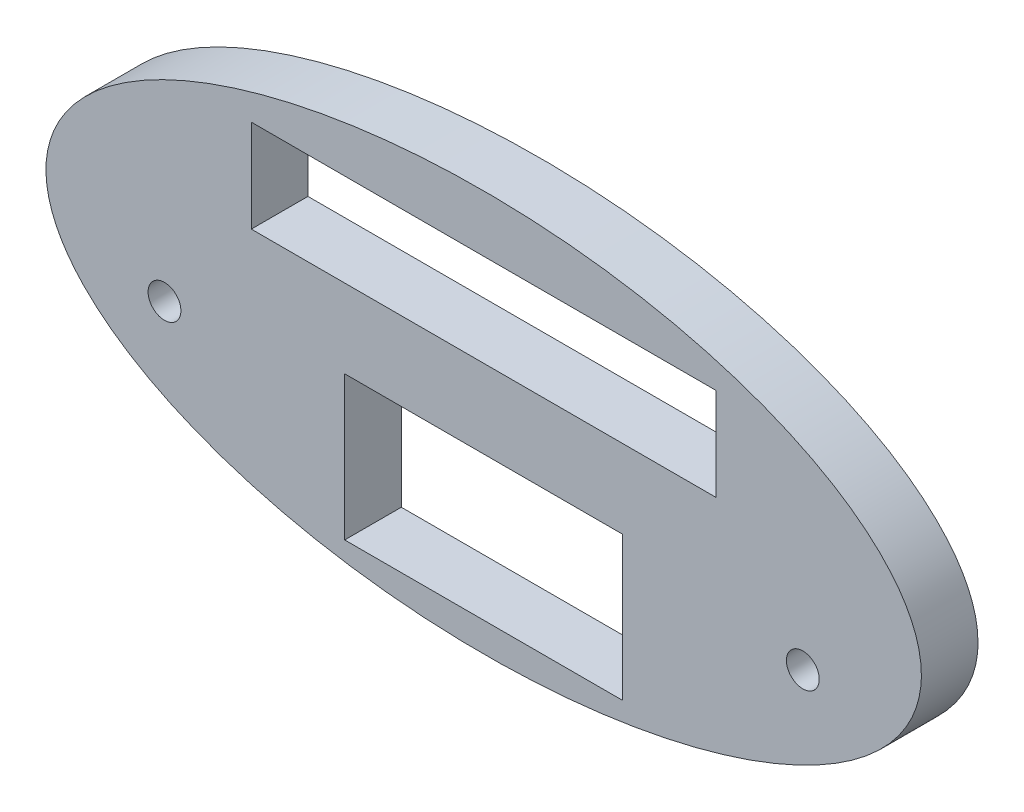
ISO-10303-21;
HEADER;
FILE_DESCRIPTION(('STEP AP214'),'2;1');
FILE_NAME('part.step','',(''),(''),'','','');
FILE_SCHEMA(('AUTOMOTIVE_DESIGN { 1 0 10303 214 1 1 1 1 }'));
ENDSEC;
DATA;
#1=APPLICATION_CONTEXT('core data for automotive mechanical design processes');
#2=APPLICATION_PROTOCOL_DEFINITION('international standard','automotive_design',2000,#1);
#3=PRODUCT_CONTEXT('',#1,'mechanical');
#4=PRODUCT('Part','Part','',(#3));
#5=PRODUCT_RELATED_PRODUCT_CATEGORY('part','',(#4));
#6=PRODUCT_DEFINITION_FORMATION('','',#4);
#7=PRODUCT_DEFINITION_CONTEXT('part definition',#1,'design');
#8=PRODUCT_DEFINITION('design','',#6,#7);
#9=PRODUCT_DEFINITION_SHAPE('','',#8);
#10=(LENGTH_UNIT() NAMED_UNIT(*) SI_UNIT(.MILLI.,.METRE.));
#11=(NAMED_UNIT(*) PLANE_ANGLE_UNIT() SI_UNIT($,.RADIAN.));
#12=(NAMED_UNIT(*) SI_UNIT($,.STERADIAN.) SOLID_ANGLE_UNIT());
#13=UNCERTAINTY_MEASURE_WITH_UNIT(LENGTH_MEASURE(1.E-05),#10,'distance_accuracy_value','');
#14=(GEOMETRIC_REPRESENTATION_CONTEXT(3) GLOBAL_UNCERTAINTY_ASSIGNED_CONTEXT((#13)) GLOBAL_UNIT_ASSIGNED_CONTEXT((#10,
#11,#12)) REPRESENTATION_CONTEXT('',''));
#15=CARTESIAN_POINT('',(0.,0.,0.));
#16=DIRECTION('',(0.,0.,1.));
#17=DIRECTION('',(1.,0.,0.));
#18=AXIS2_PLACEMENT_3D('',#15,#16,#17);
#19=CARTESIAN_POINT('',(0.,0.,-31.055));
#20=DIRECTION('',(0.,0.,1.));
#21=DIRECTION('',(1.,0.,0.));
#22=AXIS2_PLACEMENT_3D('',#19,#20,#21);
#23=ELLIPSE('',#22,240.,110.);
#24=DIRECTION('',(0.,0.,1.));
#25=VECTOR('',#24,1.);
#26=SURFACE_OF_LINEAR_EXTRUSION('',#23,#25);
#27=CARTESIAN_POINT('',(240.,0.,-31.055));
#28=VERTEX_POINT('',#27);
#29=EDGE_CURVE('E11',#28,#28,#23,.T.);
#30=ORIENTED_EDGE('',*,*,#29,.T.);
#31=EDGE_LOOP('',(#30));
#32=FACE_BOUND('',#31,.T.);
#33=CARTESIAN_POINT('',(0.,0.,0.));
#34=DIRECTION('',(0.,0.,1.));
#35=DIRECTION('',(1.,0.,0.));
#36=AXIS2_PLACEMENT_3D('',#33,#34,#35);
#37=ELLIPSE('',#36,240.,110.);
#38=CARTESIAN_POINT('',(240.,0.,0.));
#39=VERTEX_POINT('',#38);
#40=EDGE_CURVE('E39',#39,#39,#37,.T.);
#41=ORIENTED_EDGE('',*,*,#40,.F.);
#42=EDGE_LOOP('',(#41));
#43=FACE_BOUND('',#42,.T.);
#44=ADVANCED_FACE('F35',(#32,#43),#26,.T.);
#45=CARTESIAN_POINT('',(0.,0.,-31.055));
#46=DIRECTION('',(0.,0.,1.));
#47=DIRECTION('',(1.,0.,0.));
#48=AXIS2_PLACEMENT_3D('',#45,#46,#47);
#49=PLANE('',#48);
#50=CARTESIAN_POINT('',(175.,-30.,-31.055));
#51=DIRECTION('',(0.,0.,1.));
#52=DIRECTION('',(1.,0.,0.));
#53=AXIS2_PLACEMENT_3D('',#50,#51,#52);
#54=CIRCLE('',#53,9.00000000000001);
#55=CARTESIAN_POINT('',(184.,-30.,-31.055));
#56=VERTEX_POINT('',#55);
#57=EDGE_CURVE('E130',#56,#56,#54,.T.);
#58=ORIENTED_EDGE('',*,*,#57,.T.);
#59=EDGE_LOOP('',(#58));
#60=FACE_BOUND('',#59,.T.);
#61=CARTESIAN_POINT('',(-175.,-30.,-31.055));
#62=DIRECTION('',(0.,0.,1.));
#63=DIRECTION('',(-1.,0.,0.));
#64=AXIS2_PLACEMENT_3D('',#61,#62,#63);
#65=CIRCLE('',#64,9.00000000000001);
#66=CARTESIAN_POINT('',(-184.,-30.,-31.055));
#67=VERTEX_POINT('',#66);
#68=EDGE_CURVE('E248',#67,#67,#65,.T.);
#69=ORIENTED_EDGE('',*,*,#68,.T.);
#70=EDGE_LOOP('',(#69));
#71=FACE_BOUND('',#70,.T.);
#72=DIRECTION('',(-1.,0.,0.));
#73=VECTOR('',#72,1.);
#74=CARTESIAN_POINT('',(-76.2,-15.,-31.055));
#75=LINE('',#74,#73);
#76=CARTESIAN_POINT('',(76.2,-15.,-31.055));
#77=VERTEX_POINT('',#76);
#78=CARTESIAN_POINT('',(-76.2,-15.,-31.055));
#79=VERTEX_POINT('',#78);
#80=EDGE_CURVE('E107',#77,#79,#75,.T.);
#81=ORIENTED_EDGE('',*,*,#80,.T.);
#82=DIRECTION('',(0.,-1.,0.));
#83=VECTOR('',#82,1.);
#84=CARTESIAN_POINT('',(-76.2,-15.,-31.055));
#85=LINE('',#84,#83);
#86=CARTESIAN_POINT('',(-76.2,-93.9,-31.055));
#87=VERTEX_POINT('',#86);
#88=EDGE_CURVE('E101',#79,#87,#85,.T.);
#89=ORIENTED_EDGE('',*,*,#88,.T.);
#90=DIRECTION('',(1.,0.,0.));
#91=VECTOR('',#90,1.);
#92=CARTESIAN_POINT('',(-76.2,-93.9,-31.055));
#93=LINE('',#92,#91);
#94=CARTESIAN_POINT('',(76.2,-93.9,-31.055));
#95=VERTEX_POINT('',#94);
#96=EDGE_CURVE('E110',#87,#95,#93,.T.);
#97=ORIENTED_EDGE('',*,*,#96,.T.);
#98=DIRECTION('',(0.,1.,0.));
#99=VECTOR('',#98,1.);
#100=CARTESIAN_POINT('',(76.2,-15.,-31.055));
#101=LINE('',#100,#99);
#102=EDGE_CURVE('E49',#95,#77,#101,.T.);
#103=ORIENTED_EDGE('',*,*,#102,.T.);
#104=EDGE_LOOP('',(#81,#89,#97,#103));
#105=FACE_BOUND('',#104,.T.);
#106=DIRECTION('',(-1.,0.,0.));
#107=VECTOR('',#106,1.);
#108=CARTESIAN_POINT('',(-127.4,78.9000000000001,-31.055));
#109=LINE('',#108,#107);
#110=CARTESIAN_POINT('',(127.4,78.9,-31.055));
#111=VERTEX_POINT('',#110);
#112=CARTESIAN_POINT('',(-127.4,78.9000000000001,-31.055));
#113=VERTEX_POINT('',#112);
#114=EDGE_CURVE('E150',#111,#113,#109,.T.);
#115=ORIENTED_EDGE('',*,*,#114,.T.);
#116=DIRECTION('',(0.,-1.,0.));
#117=VECTOR('',#116,1.);
#118=CARTESIAN_POINT('',(-127.4,78.9000000000001,-31.055));
#119=LINE('',#118,#117);
#120=CARTESIAN_POINT('',(-127.4,28.1,-31.055));
#121=VERTEX_POINT('',#120);
#122=EDGE_CURVE('E140',#113,#121,#119,.T.);
#123=ORIENTED_EDGE('',*,*,#122,.T.);
#124=DIRECTION('',(1.,0.,0.));
#125=VECTOR('',#124,1.);
#126=CARTESIAN_POINT('',(-127.4,28.1,-31.055));
#127=LINE('',#126,#125);
#128=CARTESIAN_POINT('',(127.4,28.1,-31.055));
#129=VERTEX_POINT('',#128);
#130=EDGE_CURVE('E143',#121,#129,#127,.T.);
#131=ORIENTED_EDGE('',*,*,#130,.T.);
#132=DIRECTION('',(0.,1.,0.));
#133=VECTOR('',#132,1.);
#134=CARTESIAN_POINT('',(127.4,78.9,-31.055));
#135=LINE('',#134,#133);
#136=EDGE_CURVE('E147',#129,#111,#135,.T.);
#137=ORIENTED_EDGE('',*,*,#136,.T.);
#138=EDGE_LOOP('',(#115,#123,#131,#137));
#139=FACE_BOUND('',#138,.T.);
#140=ORIENTED_EDGE('',*,*,#29,.F.);
#141=EDGE_LOOP('',(#140));
#142=FACE_BOUND('',#141,.T.);
#143=ADVANCED_FACE('F114',(#60,#71,#105,#139,#142),#49,.F.);
#144=CARTESIAN_POINT('',(0.,0.,0.));
#145=DIRECTION('',(0.,0.,1.));
#146=DIRECTION('',(1.,0.,0.));
#147=AXIS2_PLACEMENT_3D('',#144,#145,#146);
#148=PLANE('',#147);
#149=CARTESIAN_POINT('',(175.,-30.,0.));
#150=DIRECTION('',(0.,0.,1.));
#151=DIRECTION('',(1.,0.,0.));
#152=AXIS2_PLACEMENT_3D('',#149,#150,#151);
#153=CIRCLE('',#152,9.00000000000001);
#154=CARTESIAN_POINT('',(184.,-30.,0.));
#155=VERTEX_POINT('',#154);
#156=EDGE_CURVE('E247',#155,#155,#153,.T.);
#157=ORIENTED_EDGE('',*,*,#156,.F.);
#158=EDGE_LOOP('',(#157));
#159=FACE_BOUND('',#158,.T.);
#160=CARTESIAN_POINT('',(-175.,-30.,0.));
#161=DIRECTION('',(0.,0.,1.));
#162=DIRECTION('',(-1.,0.,0.));
#163=AXIS2_PLACEMENT_3D('',#160,#161,#162);
#164=CIRCLE('',#163,9.00000000000001);
#165=CARTESIAN_POINT('',(-184.,-30.,0.));
#166=VERTEX_POINT('',#165);
#167=EDGE_CURVE('E123',#166,#166,#164,.T.);
#168=ORIENTED_EDGE('',*,*,#167,.F.);
#169=EDGE_LOOP('',(#168));
#170=FACE_BOUND('',#169,.T.);
#171=DIRECTION('',(0.,-1.,0.));
#172=VECTOR('',#171,1.);
#173=CARTESIAN_POINT('',(-76.2,-15.,0.));
#174=LINE('',#173,#172);
#175=CARTESIAN_POINT('',(-76.2,-15.,0.));
#176=VERTEX_POINT('',#175);
#177=CARTESIAN_POINT('',(-76.2,-93.9,0.));
#178=VERTEX_POINT('',#177);
#179=EDGE_CURVE('E57',#176,#178,#174,.T.);
#180=ORIENTED_EDGE('',*,*,#179,.F.);
#181=DIRECTION('',(-1.,0.,0.));
#182=VECTOR('',#181,1.);
#183=CARTESIAN_POINT('',(-76.2,-15.,0.));
#184=LINE('',#183,#182);
#185=CARTESIAN_POINT('',(76.2,-15.,0.));
#186=VERTEX_POINT('',#185);
#187=EDGE_CURVE('E117',#186,#176,#184,.T.);
#188=ORIENTED_EDGE('',*,*,#187,.F.);
#189=DIRECTION('',(0.,1.,0.));
#190=VECTOR('',#189,1.);
#191=CARTESIAN_POINT('',(76.2,-15.,0.));
#192=LINE('',#191,#190);
#193=CARTESIAN_POINT('',(76.2,-93.9,0.));
#194=VERTEX_POINT('',#193);
#195=EDGE_CURVE('E120',#194,#186,#192,.T.);
#196=ORIENTED_EDGE('',*,*,#195,.F.);
#197=DIRECTION('',(1.,0.,0.));
#198=VECTOR('',#197,1.);
#199=CARTESIAN_POINT('',(-76.2,-93.9,0.));
#200=LINE('',#199,#198);
#201=EDGE_CURVE('E129',#178,#194,#200,.T.);
#202=ORIENTED_EDGE('',*,*,#201,.F.);
#203=EDGE_LOOP('',(#180,#188,#196,#202));
#204=FACE_BOUND('',#203,.T.);
#205=DIRECTION('',(0.,-1.,0.));
#206=VECTOR('',#205,1.);
#207=CARTESIAN_POINT('',(-127.4,78.9000000000001,0.));
#208=LINE('',#207,#206);
#209=CARTESIAN_POINT('',(-127.4,78.9000000000001,0.));
#210=VERTEX_POINT('',#209);
#211=CARTESIAN_POINT('',(-127.4,28.1,0.));
#212=VERTEX_POINT('',#211);
#213=EDGE_CURVE('E136',#210,#212,#208,.T.);
#214=ORIENTED_EDGE('',*,*,#213,.F.);
#215=DIRECTION('',(-1.,0.,0.));
#216=VECTOR('',#215,1.);
#217=CARTESIAN_POINT('',(-127.4,78.9000000000001,0.));
#218=LINE('',#217,#216);
#219=CARTESIAN_POINT('',(127.4,78.9,0.));
#220=VERTEX_POINT('',#219);
#221=EDGE_CURVE('E144',#220,#210,#218,.T.);
#222=ORIENTED_EDGE('',*,*,#221,.F.);
#223=DIRECTION('',(0.,1.,0.));
#224=VECTOR('',#223,1.);
#225=CARTESIAN_POINT('',(127.4,78.9,0.));
#226=LINE('',#225,#224);
#227=CARTESIAN_POINT('',(127.4,28.1,0.));
#228=VERTEX_POINT('',#227);
#229=EDGE_CURVE('E158',#228,#220,#226,.T.);
#230=ORIENTED_EDGE('',*,*,#229,.F.);
#231=DIRECTION('',(1.,0.,0.));
#232=VECTOR('',#231,1.);
#233=CARTESIAN_POINT('',(-127.4,28.1,0.));
#234=LINE('',#233,#232);
#235=EDGE_CURVE('E155',#212,#228,#234,.T.);
#236=ORIENTED_EDGE('',*,*,#235,.F.);
#237=EDGE_LOOP('',(#214,#222,#230,#236));
#238=FACE_BOUND('',#237,.T.);
#239=ORIENTED_EDGE('',*,*,#40,.T.);
#240=EDGE_LOOP('',(#239));
#241=FACE_BOUND('',#240,.T.);
#242=ADVANCED_FACE('F181',(#159,#170,#204,#238,#241),#148,.T.);
#243=CARTESIAN_POINT('',(-127.4,78.9000000000001,-31.055));
#244=DIRECTION('',(-1.,0.,0.));
#245=DIRECTION('',(0.,0.,1.));
#246=AXIS2_PLACEMENT_3D('',#243,#244,#245);
#247=PLANE('',#246);
#248=ORIENTED_EDGE('',*,*,#213,.T.);
#249=DIRECTION('',(0.,0.,1.));
#250=VECTOR('',#249,1.);
#251=CARTESIAN_POINT('',(-127.4,28.1,-31.055));
#252=LINE('',#251,#250);
#253=EDGE_CURVE('E153',#121,#212,#252,.T.);
#254=ORIENTED_EDGE('',*,*,#253,.F.);
#255=ORIENTED_EDGE('',*,*,#122,.F.);
#256=DIRECTION('',(0.,0.,1.));
#257=VECTOR('',#256,1.);
#258=CARTESIAN_POINT('',(-127.4,78.9000000000001,-31.055));
#259=LINE('',#258,#257);
#260=EDGE_CURVE('E163',#113,#210,#259,.T.);
#261=ORIENTED_EDGE('',*,*,#260,.T.);
#262=EDGE_LOOP('',(#248,#254,#255,#261));
#263=FACE_BOUND('',#262,.T.);
#264=ADVANCED_FACE('F188',(#263),#247,.F.);
#265=CARTESIAN_POINT('',(-127.4,78.9000000000001,-31.055));
#266=DIRECTION('',(0.,1.,0.));
#267=DIRECTION('',(-1.,0.,0.));
#268=AXIS2_PLACEMENT_3D('',#265,#266,#267);
#269=PLANE('',#268);
#270=ORIENTED_EDGE('',*,*,#221,.T.);
#271=ORIENTED_EDGE('',*,*,#260,.F.);
#272=ORIENTED_EDGE('',*,*,#114,.F.);
#273=DIRECTION('',(0.,0.,1.));
#274=VECTOR('',#273,1.);
#275=CARTESIAN_POINT('',(127.4,78.9,-31.055));
#276=LINE('',#275,#274);
#277=EDGE_CURVE('E165',#111,#220,#276,.T.);
#278=ORIENTED_EDGE('',*,*,#277,.T.);
#279=EDGE_LOOP('',(#270,#271,#272,#278));
#280=FACE_BOUND('',#279,.T.);
#281=ADVANCED_FACE('F190',(#280),#269,.F.);
#282=CARTESIAN_POINT('',(127.4,78.9,-31.055));
#283=DIRECTION('',(1.,0.,0.));
#284=DIRECTION('',(0.,0.,-1.));
#285=AXIS2_PLACEMENT_3D('',#282,#283,#284);
#286=PLANE('',#285);
#287=ORIENTED_EDGE('',*,*,#229,.T.);
#288=ORIENTED_EDGE('',*,*,#277,.F.);
#289=ORIENTED_EDGE('',*,*,#136,.F.);
#290=DIRECTION('',(0.,0.,1.));
#291=VECTOR('',#290,1.);
#292=CARTESIAN_POINT('',(127.4,28.1,-31.055));
#293=LINE('',#292,#291);
#294=EDGE_CURVE('E167',#129,#228,#293,.T.);
#295=ORIENTED_EDGE('',*,*,#294,.T.);
#296=EDGE_LOOP('',(#287,#288,#289,#295));
#297=FACE_BOUND('',#296,.T.);
#298=ADVANCED_FACE('F185',(#297),#286,.F.);
#299=CARTESIAN_POINT('',(-127.4,28.1,-31.055));
#300=DIRECTION('',(0.,-1.,0.));
#301=DIRECTION('',(1.,0.,0.));
#302=AXIS2_PLACEMENT_3D('',#299,#300,#301);
#303=PLANE('',#302);
#304=ORIENTED_EDGE('',*,*,#235,.T.);
#305=ORIENTED_EDGE('',*,*,#294,.F.);
#306=ORIENTED_EDGE('',*,*,#130,.F.);
#307=ORIENTED_EDGE('',*,*,#253,.T.);
#308=EDGE_LOOP('',(#304,#305,#306,#307));
#309=FACE_BOUND('',#308,.T.);
#310=ADVANCED_FACE('F174',(#309),#303,.F.);
#311=CARTESIAN_POINT('',(-76.2,-15.,-31.055));
#312=DIRECTION('',(-1.,0.,0.));
#313=DIRECTION('',(0.,-1.,0.));
#314=AXIS2_PLACEMENT_3D('',#311,#312,#313);
#315=PLANE('',#314);
#316=ORIENTED_EDGE('',*,*,#179,.T.);
#317=DIRECTION('',(0.,0.,1.));
#318=VECTOR('',#317,1.);
#319=CARTESIAN_POINT('',(-76.2,-93.9,-31.055));
#320=LINE('',#319,#318);
#321=EDGE_CURVE('E97',#87,#178,#320,.T.);
#322=ORIENTED_EDGE('',*,*,#321,.F.);
#323=ORIENTED_EDGE('',*,*,#88,.F.);
#324=DIRECTION('',(0.,0.,1.));
#325=VECTOR('',#324,1.);
#326=CARTESIAN_POINT('',(-76.2,-15.,-31.055));
#327=LINE('',#326,#325);
#328=EDGE_CURVE('E134',#79,#176,#327,.T.);
#329=ORIENTED_EDGE('',*,*,#328,.T.);
#330=EDGE_LOOP('',(#316,#322,#323,#329));
#331=FACE_BOUND('',#330,.T.);
#332=ADVANCED_FACE('F99',(#331),#315,.F.);
#333=CARTESIAN_POINT('',(-76.2,-15.,-31.055));
#334=DIRECTION('',(0.,1.,0.));
#335=DIRECTION('',(0.,0.,1.));
#336=AXIS2_PLACEMENT_3D('',#333,#334,#335);
#337=PLANE('',#336);
#338=ORIENTED_EDGE('',*,*,#187,.T.);
#339=ORIENTED_EDGE('',*,*,#328,.F.);
#340=ORIENTED_EDGE('',*,*,#80,.F.);
#341=DIRECTION('',(0.,0.,1.));
#342=VECTOR('',#341,1.);
#343=CARTESIAN_POINT('',(76.2,-15.,-31.055));
#344=LINE('',#343,#342);
#345=EDGE_CURVE('E137',#77,#186,#344,.T.);
#346=ORIENTED_EDGE('',*,*,#345,.T.);
#347=EDGE_LOOP('',(#338,#339,#340,#346));
#348=FACE_BOUND('',#347,.T.);
#349=ADVANCED_FACE('F222',(#348),#337,.F.);
#350=CARTESIAN_POINT('',(76.2,-15.,-31.055));
#351=DIRECTION('',(1.,0.,0.));
#352=DIRECTION('',(0.,1.,0.));
#353=AXIS2_PLACEMENT_3D('',#350,#351,#352);
#354=PLANE('',#353);
#355=ORIENTED_EDGE('',*,*,#195,.T.);
#356=ORIENTED_EDGE('',*,*,#345,.F.);
#357=ORIENTED_EDGE('',*,*,#102,.F.);
#358=DIRECTION('',(0.,0.,1.));
#359=VECTOR('',#358,1.);
#360=CARTESIAN_POINT('',(76.2,-93.9,-31.055));
#361=LINE('',#360,#359);
#362=EDGE_CURVE('E106',#95,#194,#361,.T.);
#363=ORIENTED_EDGE('',*,*,#362,.T.);
#364=EDGE_LOOP('',(#355,#356,#357,#363));
#365=FACE_BOUND('',#364,.T.);
#366=ADVANCED_FACE('F226',(#365),#354,.F.);
#367=CARTESIAN_POINT('',(-76.2,-93.9,-31.055));
#368=DIRECTION('',(0.,-1.,0.));
#369=DIRECTION('',(0.,0.,-1.));
#370=AXIS2_PLACEMENT_3D('',#367,#368,#369);
#371=PLANE('',#370);
#372=ORIENTED_EDGE('',*,*,#201,.T.);
#373=ORIENTED_EDGE('',*,*,#362,.F.);
#374=ORIENTED_EDGE('',*,*,#96,.F.);
#375=ORIENTED_EDGE('',*,*,#321,.T.);
#376=EDGE_LOOP('',(#372,#373,#374,#375));
#377=FACE_BOUND('',#376,.T.);
#378=ADVANCED_FACE('F111',(#377),#371,.F.);
#379=CARTESIAN_POINT('',(-175.,-30.,-31.055));
#380=DIRECTION('',(0.,0.,1.));
#381=DIRECTION('',(1.,0.,0.));
#382=AXIS2_PLACEMENT_3D('',#379,#380,#381);
#383=CYLINDRICAL_SURFACE('',#382,9.00000000000001);
#384=ORIENTED_EDGE('',*,*,#68,.F.);
#385=EDGE_LOOP('',(#384));
#386=FACE_BOUND('',#385,.T.);
#387=ORIENTED_EDGE('',*,*,#167,.T.);
#388=EDGE_LOOP('',(#387));
#389=FACE_BOUND('',#388,.T.);
#390=ADVANCED_FACE('F232',(#386,#389),#383,.F.);
#391=CARTESIAN_POINT('',(175.,-30.,-31.055));
#392=DIRECTION('',(0.,0.,1.));
#393=DIRECTION('',(1.,0.,0.));
#394=AXIS2_PLACEMENT_3D('',#391,#392,#393);
#395=CYLINDRICAL_SURFACE('',#394,9.00000000000001);
#396=ORIENTED_EDGE('',*,*,#57,.F.);
#397=EDGE_LOOP('',(#396));
#398=FACE_BOUND('',#397,.T.);
#399=ORIENTED_EDGE('',*,*,#156,.T.);
#400=EDGE_LOOP('',(#399));
#401=FACE_BOUND('',#400,.T.);
#402=ADVANCED_FACE('F237',(#398,#401),#395,.F.);
#403=CLOSED_SHELL('',(#44,#143,#242,#264,#281,#298,#310,#332,#349,#366,#378,#390,#402));
#404=MANIFOLD_SOLID_BREP('B2',#403);
#405=ADVANCED_BREP_SHAPE_REPRESENTATION('',(#18,#404),#14);
#406=SHAPE_DEFINITION_REPRESENTATION(#9,#405);
ENDSEC;
END-ISO-10303-21;
